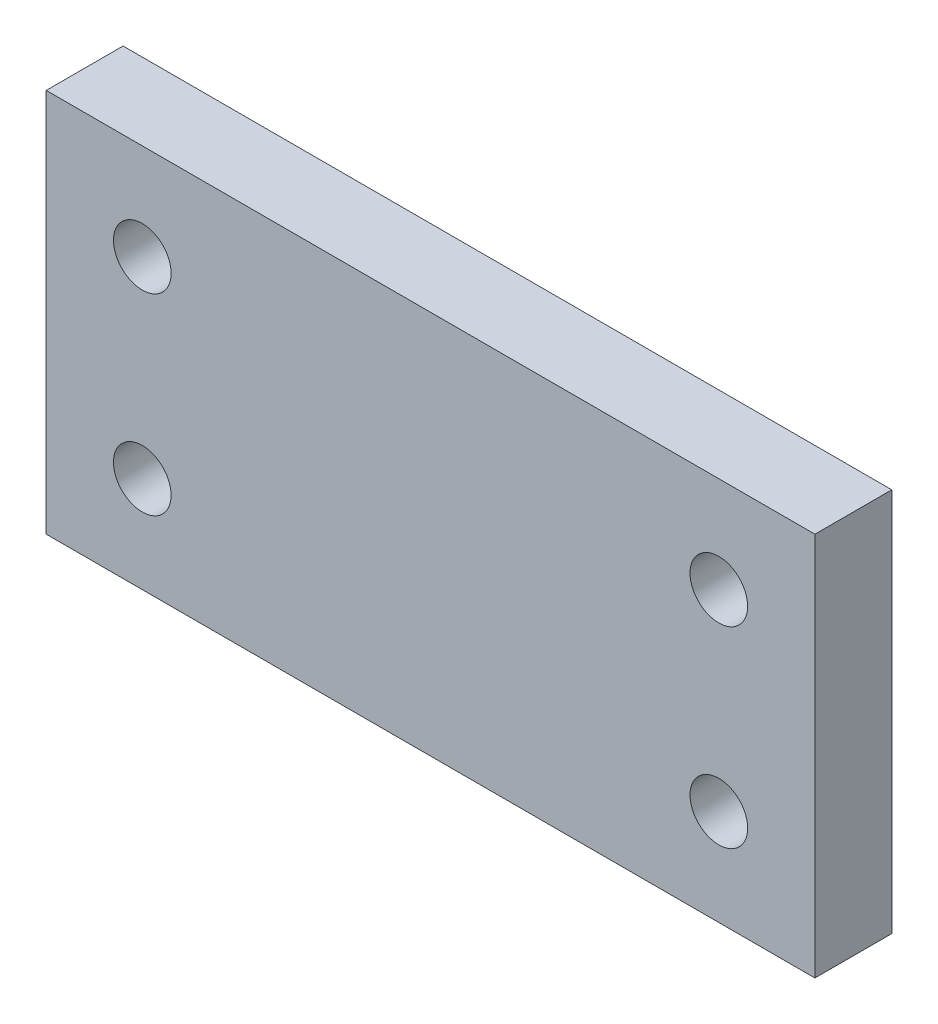
ISO-10303-21;
HEADER;
FILE_DESCRIPTION(('STEP AP214'),'2;1');
FILE_NAME('part.step','',(''),(''),'','','');
FILE_SCHEMA(('AUTOMOTIVE_DESIGN { 1 0 10303 214 1 1 1 1 }'));
ENDSEC;
DATA;
#1=APPLICATION_CONTEXT('core data for automotive mechanical design processes');
#2=APPLICATION_PROTOCOL_DEFINITION('international standard','automotive_design',2000,#1);
#3=PRODUCT_CONTEXT('',#1,'mechanical');
#4=PRODUCT('Part','Part','',(#3));
#5=PRODUCT_RELATED_PRODUCT_CATEGORY('part','',(#4));
#6=PRODUCT_DEFINITION_FORMATION('','',#4);
#7=PRODUCT_DEFINITION_CONTEXT('part definition',#1,'design');
#8=PRODUCT_DEFINITION('design','',#6,#7);
#9=PRODUCT_DEFINITION_SHAPE('','',#8);
#10=(LENGTH_UNIT() NAMED_UNIT(*) SI_UNIT(.MILLI.,.METRE.));
#11=(NAMED_UNIT(*) PLANE_ANGLE_UNIT() SI_UNIT($,.RADIAN.));
#12=(NAMED_UNIT(*) SI_UNIT($,.STERADIAN.) SOLID_ANGLE_UNIT());
#13=UNCERTAINTY_MEASURE_WITH_UNIT(LENGTH_MEASURE(1.E-05),#10,'distance_accuracy_value','');
#14=(GEOMETRIC_REPRESENTATION_CONTEXT(3) GLOBAL_UNCERTAINTY_ASSIGNED_CONTEXT((#13)) GLOBAL_UNIT_ASSIGNED_CONTEXT((#10,
#11,#12)) REPRESENTATION_CONTEXT('',''));
#15=CARTESIAN_POINT('',(0.,0.,0.));
#16=DIRECTION('',(0.,0.,1.));
#17=DIRECTION('',(1.,0.,0.));
#18=AXIS2_PLACEMENT_3D('',#15,#16,#17);
#19=CARTESIAN_POINT('',(0.,0.,8.));
#20=DIRECTION('',(0.,0.,1.));
#21=DIRECTION('',(1.,0.,0.));
#22=AXIS2_PLACEMENT_3D('',#19,#20,#21);
#23=PLANE('',#22);
#24=CARTESIAN_POINT('',(30.0000000000006,-9.99999999999546,8.));
#25=DIRECTION('',(0.,0.,1.));
#26=DIRECTION('',(1.,0.,0.));
#27=AXIS2_PLACEMENT_3D('',#24,#25,#26);
#28=CIRCLE('',#27,3.);
#29=CARTESIAN_POINT('',(33.0000000000006,-9.99999999999546,8.));
#30=VERTEX_POINT('',#29);
#31=EDGE_CURVE('E142',#30,#30,#28,.T.);
#32=ORIENTED_EDGE('',*,*,#31,.F.);
#33=EDGE_LOOP('',(#32));
#34=FACE_BOUND('',#33,.T.);
#35=CARTESIAN_POINT('',(-30.0000000000006,9.99999999999545,8.));
#36=DIRECTION('',(0.,0.,1.));
#37=DIRECTION('',(1.,0.,0.));
#38=AXIS2_PLACEMENT_3D('',#35,#36,#37);
#39=CIRCLE('',#38,3.);
#40=CARTESIAN_POINT('',(-27.0000000000006,9.99999999999545,8.));
#41=VERTEX_POINT('',#40);
#42=EDGE_CURVE('E112',#41,#41,#39,.T.);
#43=ORIENTED_EDGE('',*,*,#42,.F.);
#44=EDGE_LOOP('',(#43));
#45=FACE_BOUND('',#44,.T.);
#46=DIRECTION('',(0.,1.,0.));
#47=VECTOR('',#46,1.);
#48=CARTESIAN_POINT('',(40.,20.,8.));
#49=LINE('',#48,#47);
#50=CARTESIAN_POINT('',(40.,-20.,8.));
#51=VERTEX_POINT('',#50);
#52=CARTESIAN_POINT('',(40.,20.,8.));
#53=VERTEX_POINT('',#52);
#54=EDGE_CURVE('E92',#51,#53,#49,.T.);
#55=ORIENTED_EDGE('',*,*,#54,.T.);
#56=DIRECTION('',(-1.,0.,0.));
#57=VECTOR('',#56,1.);
#58=CARTESIAN_POINT('',(-40.,20.,8.));
#59=LINE('',#58,#57);
#60=CARTESIAN_POINT('',(-40.,20.,8.));
#61=VERTEX_POINT('',#60);
#62=EDGE_CURVE('E87',#53,#61,#59,.T.);
#63=ORIENTED_EDGE('',*,*,#62,.T.);
#64=DIRECTION('',(0.,-1.,0.));
#65=VECTOR('',#64,1.);
#66=CARTESIAN_POINT('',(-40.,20.,8.));
#67=LINE('',#66,#65);
#68=CARTESIAN_POINT('',(-40.,-20.,8.));
#69=VERTEX_POINT('',#68);
#70=EDGE_CURVE('E90',#61,#69,#67,.T.);
#71=ORIENTED_EDGE('',*,*,#70,.T.);
#72=DIRECTION('',(1.,0.,0.));
#73=VECTOR('',#72,1.);
#74=CARTESIAN_POINT('',(-40.,-20.,8.));
#75=LINE('',#74,#73);
#76=EDGE_CURVE('E57',#69,#51,#75,.T.);
#77=ORIENTED_EDGE('',*,*,#76,.T.);
#78=EDGE_LOOP('',(#55,#63,#71,#77));
#79=FACE_BOUND('',#78,.T.);
#80=CARTESIAN_POINT('',(-30.0000000000006,-9.99999999999546,8.));
#81=DIRECTION('',(0.,0.,1.));
#82=DIRECTION('',(-1.,0.,0.));
#83=AXIS2_PLACEMENT_3D('',#80,#81,#82);
#84=CIRCLE('',#83,3.);
#85=CARTESIAN_POINT('',(-33.0000000000006,-9.99999999999546,8.));
#86=VERTEX_POINT('',#85);
#87=EDGE_CURVE('E134',#86,#86,#84,.T.);
#88=ORIENTED_EDGE('',*,*,#87,.F.);
#89=EDGE_LOOP('',(#88));
#90=FACE_BOUND('',#89,.T.);
#91=CARTESIAN_POINT('',(30.0000000000006,9.99999999999545,8.));
#92=DIRECTION('',(0.,0.,1.));
#93=DIRECTION('',(-1.,0.,0.));
#94=AXIS2_PLACEMENT_3D('',#91,#92,#93);
#95=CIRCLE('',#94,3.);
#96=CARTESIAN_POINT('',(27.0000000000006,9.99999999999545,8.));
#97=VERTEX_POINT('',#96);
#98=EDGE_CURVE('E150',#97,#97,#95,.T.);
#99=ORIENTED_EDGE('',*,*,#98,.F.);
#100=EDGE_LOOP('',(#99));
#101=FACE_BOUND('',#100,.T.);
#102=ADVANCED_FACE('F39',(#34,#45,#79,#90,#101),#23,.T.);
#103=CARTESIAN_POINT('',(0.,0.,0.));
#104=DIRECTION('',(0.,0.,1.));
#105=DIRECTION('',(1.,0.,0.));
#106=AXIS2_PLACEMENT_3D('',#103,#104,#105);
#107=PLANE('',#106);
#108=DIRECTION('',(0.,1.,0.));
#109=VECTOR('',#108,1.);
#110=CARTESIAN_POINT('',(40.,20.,0.));
#111=LINE('',#110,#109);
#112=CARTESIAN_POINT('',(40.,-20.,0.));
#113=VERTEX_POINT('',#112);
#114=CARTESIAN_POINT('',(40.,20.,0.));
#115=VERTEX_POINT('',#114);
#116=EDGE_CURVE('E108',#113,#115,#111,.T.);
#117=ORIENTED_EDGE('',*,*,#116,.F.);
#118=DIRECTION('',(1.,0.,0.));
#119=VECTOR('',#118,1.);
#120=CARTESIAN_POINT('',(-40.,-20.,0.));
#121=LINE('',#120,#119);
#122=CARTESIAN_POINT('',(-40.,-20.,0.));
#123=VERTEX_POINT('',#122);
#124=EDGE_CURVE('E80',#123,#113,#121,.T.);
#125=ORIENTED_EDGE('',*,*,#124,.F.);
#126=DIRECTION('',(0.,-1.,0.));
#127=VECTOR('',#126,1.);
#128=CARTESIAN_POINT('',(-40.,20.,0.));
#129=LINE('',#128,#127);
#130=CARTESIAN_POINT('',(-40.,20.,0.));
#131=VERTEX_POINT('',#130);
#132=EDGE_CURVE('E74',#131,#123,#129,.T.);
#133=ORIENTED_EDGE('',*,*,#132,.F.);
#134=DIRECTION('',(-1.,0.,0.));
#135=VECTOR('',#134,1.);
#136=CARTESIAN_POINT('',(-40.,20.,0.));
#137=LINE('',#136,#135);
#138=EDGE_CURVE('E97',#115,#131,#137,.T.);
#139=ORIENTED_EDGE('',*,*,#138,.F.);
#140=EDGE_LOOP('',(#117,#125,#133,#139));
#141=FACE_BOUND('',#140,.T.);
#142=CARTESIAN_POINT('',(-30.0000000000006,9.99999999999545,0.));
#143=DIRECTION('',(0.,0.,1.));
#144=DIRECTION('',(1.,0.,0.));
#145=AXIS2_PLACEMENT_3D('',#142,#143,#144);
#146=CIRCLE('',#145,3.);
#147=CARTESIAN_POINT('',(-27.0000000000006,9.99999999999545,0.));
#148=VERTEX_POINT('',#147);
#149=EDGE_CURVE('E130',#148,#148,#146,.T.);
#150=ORIENTED_EDGE('',*,*,#149,.T.);
#151=EDGE_LOOP('',(#150));
#152=FACE_BOUND('',#151,.T.);
#153=CARTESIAN_POINT('',(-30.0000000000006,-9.99999999999546,0.));
#154=DIRECTION('',(0.,0.,1.));
#155=DIRECTION('',(-1.,0.,0.));
#156=AXIS2_PLACEMENT_3D('',#153,#154,#155);
#157=CIRCLE('',#156,3.);
#158=CARTESIAN_POINT('',(-33.0000000000006,-9.99999999999546,0.));
#159=VERTEX_POINT('',#158);
#160=EDGE_CURVE('E138',#159,#159,#157,.T.);
#161=ORIENTED_EDGE('',*,*,#160,.T.);
#162=EDGE_LOOP('',(#161));
#163=FACE_BOUND('',#162,.T.);
#164=CARTESIAN_POINT('',(30.0000000000006,-9.99999999999546,0.));
#165=DIRECTION('',(0.,0.,1.));
#166=DIRECTION('',(1.,0.,0.));
#167=AXIS2_PLACEMENT_3D('',#164,#165,#166);
#168=CIRCLE('',#167,3.);
#169=CARTESIAN_POINT('',(33.0000000000006,-9.99999999999546,0.));
#170=VERTEX_POINT('',#169);
#171=EDGE_CURVE('E146',#170,#170,#168,.T.);
#172=ORIENTED_EDGE('',*,*,#171,.T.);
#173=EDGE_LOOP('',(#172));
#174=FACE_BOUND('',#173,.T.);
#175=CARTESIAN_POINT('',(30.0000000000006,9.99999999999545,0.));
#176=DIRECTION('',(0.,0.,1.));
#177=DIRECTION('',(-1.,0.,0.));
#178=AXIS2_PLACEMENT_3D('',#175,#176,#177);
#179=CIRCLE('',#178,3.);
#180=CARTESIAN_POINT('',(27.0000000000006,9.99999999999545,0.));
#181=VERTEX_POINT('',#180);
#182=EDGE_CURVE('E154',#181,#181,#179,.T.);
#183=ORIENTED_EDGE('',*,*,#182,.T.);
#184=EDGE_LOOP('',(#183));
#185=FACE_BOUND('',#184,.T.);
#186=ADVANCED_FACE('F125',(#141,#152,#163,#174,#185),#107,.F.);
#187=CARTESIAN_POINT('',(40.,20.,8.));
#188=DIRECTION('',(-1.,0.,0.));
#189=DIRECTION('',(0.,0.,1.));
#190=AXIS2_PLACEMENT_3D('',#187,#188,#189);
#191=PLANE('',#190);
#192=ORIENTED_EDGE('',*,*,#116,.T.);
#193=DIRECTION('',(0.,0.,-1.));
#194=VECTOR('',#193,1.);
#195=CARTESIAN_POINT('',(40.,20.,8.));
#196=LINE('',#195,#194);
#197=EDGE_CURVE('E11',#53,#115,#196,.T.);
#198=ORIENTED_EDGE('',*,*,#197,.F.);
#199=ORIENTED_EDGE('',*,*,#54,.F.);
#200=DIRECTION('',(0.,0.,-1.));
#201=VECTOR('',#200,1.);
#202=CARTESIAN_POINT('',(40.,-20.,8.));
#203=LINE('',#202,#201);
#204=EDGE_CURVE('E104',#51,#113,#203,.T.);
#205=ORIENTED_EDGE('',*,*,#204,.T.);
#206=EDGE_LOOP('',(#192,#198,#199,#205));
#207=FACE_BOUND('',#206,.T.);
#208=ADVANCED_FACE('F41',(#207),#191,.F.);
#209=CARTESIAN_POINT('',(-40.,20.,8.));
#210=DIRECTION('',(0.,-1.,0.));
#211=DIRECTION('',(0.,0.,-1.));
#212=AXIS2_PLACEMENT_3D('',#209,#210,#211);
#213=PLANE('',#212);
#214=ORIENTED_EDGE('',*,*,#138,.T.);
#215=DIRECTION('',(0.,0.,-1.));
#216=VECTOR('',#215,1.);
#217=CARTESIAN_POINT('',(-40.,20.,8.));
#218=LINE('',#217,#216);
#219=EDGE_CURVE('E49',#61,#131,#218,.T.);
#220=ORIENTED_EDGE('',*,*,#219,.F.);
#221=ORIENTED_EDGE('',*,*,#62,.F.);
#222=ORIENTED_EDGE('',*,*,#197,.T.);
#223=EDGE_LOOP('',(#214,#220,#221,#222));
#224=FACE_BOUND('',#223,.T.);
#225=ADVANCED_FACE('F96',(#224),#213,.F.);
#226=CARTESIAN_POINT('',(-40.,20.,8.));
#227=DIRECTION('',(1.,0.,0.));
#228=DIRECTION('',(0.,1.,0.));
#229=AXIS2_PLACEMENT_3D('',#226,#227,#228);
#230=PLANE('',#229);
#231=ORIENTED_EDGE('',*,*,#132,.T.);
#232=DIRECTION('',(0.,0.,-1.));
#233=VECTOR('',#232,1.);
#234=CARTESIAN_POINT('',(-40.,-20.,8.));
#235=LINE('',#234,#233);
#236=EDGE_CURVE('E99',#69,#123,#235,.T.);
#237=ORIENTED_EDGE('',*,*,#236,.F.);
#238=ORIENTED_EDGE('',*,*,#70,.F.);
#239=ORIENTED_EDGE('',*,*,#219,.T.);
#240=EDGE_LOOP('',(#231,#237,#238,#239));
#241=FACE_BOUND('',#240,.T.);
#242=ADVANCED_FACE('F100',(#241),#230,.F.);
#243=CARTESIAN_POINT('',(-40.,-20.,8.));
#244=DIRECTION('',(0.,1.,0.));
#245=DIRECTION('',(0.,0.,1.));
#246=AXIS2_PLACEMENT_3D('',#243,#244,#245);
#247=PLANE('',#246);
#248=ORIENTED_EDGE('',*,*,#124,.T.);
#249=ORIENTED_EDGE('',*,*,#204,.F.);
#250=ORIENTED_EDGE('',*,*,#76,.F.);
#251=ORIENTED_EDGE('',*,*,#236,.T.);
#252=EDGE_LOOP('',(#248,#249,#250,#251));
#253=FACE_BOUND('',#252,.T.);
#254=ADVANCED_FACE('F122',(#253),#247,.F.);
#255=CARTESIAN_POINT('',(-30.0000000000006,9.99999999999545,8.));
#256=DIRECTION('',(0.,0.,-1.));
#257=DIRECTION('',(-1.,0.,0.));
#258=AXIS2_PLACEMENT_3D('',#255,#256,#257);
#259=CYLINDRICAL_SURFACE('',#258,3.);
#260=ORIENTED_EDGE('',*,*,#42,.T.);
#261=EDGE_LOOP('',(#260));
#262=FACE_BOUND('',#261,.T.);
#263=ORIENTED_EDGE('',*,*,#149,.F.);
#264=EDGE_LOOP('',(#263));
#265=FACE_BOUND('',#264,.T.);
#266=ADVANCED_FACE('F175',(#262,#265),#259,.F.);
#267=CARTESIAN_POINT('',(-30.0000000000006,-9.99999999999546,8.));
#268=DIRECTION('',(0.,0.,-1.));
#269=DIRECTION('',(-1.,0.,0.));
#270=AXIS2_PLACEMENT_3D('',#267,#268,#269);
#271=CYLINDRICAL_SURFACE('',#270,3.);
#272=ORIENTED_EDGE('',*,*,#87,.T.);
#273=EDGE_LOOP('',(#272));
#274=FACE_BOUND('',#273,.T.);
#275=ORIENTED_EDGE('',*,*,#160,.F.);
#276=EDGE_LOOP('',(#275));
#277=FACE_BOUND('',#276,.T.);
#278=ADVANCED_FACE('F221',(#274,#277),#271,.F.);
#279=CARTESIAN_POINT('',(30.0000000000006,-9.99999999999546,8.));
#280=DIRECTION('',(0.,0.,-1.));
#281=DIRECTION('',(-1.,0.,0.));
#282=AXIS2_PLACEMENT_3D('',#279,#280,#281);
#283=CYLINDRICAL_SURFACE('',#282,3.);
#284=ORIENTED_EDGE('',*,*,#31,.T.);
#285=EDGE_LOOP('',(#284));
#286=FACE_BOUND('',#285,.T.);
#287=ORIENTED_EDGE('',*,*,#171,.F.);
#288=EDGE_LOOP('',(#287));
#289=FACE_BOUND('',#288,.T.);
#290=ADVANCED_FACE('F229',(#286,#289),#283,.F.);
#291=CARTESIAN_POINT('',(30.0000000000006,9.99999999999545,8.));
#292=DIRECTION('',(0.,0.,-1.));
#293=DIRECTION('',(-1.,0.,0.));
#294=AXIS2_PLACEMENT_3D('',#291,#292,#293);
#295=CYLINDRICAL_SURFACE('',#294,3.);
#296=ORIENTED_EDGE('',*,*,#98,.T.);
#297=EDGE_LOOP('',(#296));
#298=FACE_BOUND('',#297,.T.);
#299=ORIENTED_EDGE('',*,*,#182,.F.);
#300=EDGE_LOOP('',(#299));
#301=FACE_BOUND('',#300,.T.);
#302=ADVANCED_FACE('F162',(#298,#301),#295,.F.);
#303=CLOSED_SHELL('',(#102,#186,#208,#225,#242,#254,#266,#278,#290,#302));
#304=MANIFOLD_SOLID_BREP('B2',#303);
#305=ADVANCED_BREP_SHAPE_REPRESENTATION('',(#18,#304),#14);
#306=SHAPE_DEFINITION_REPRESENTATION(#9,#305);
ENDSEC;
END-ISO-10303-21;
